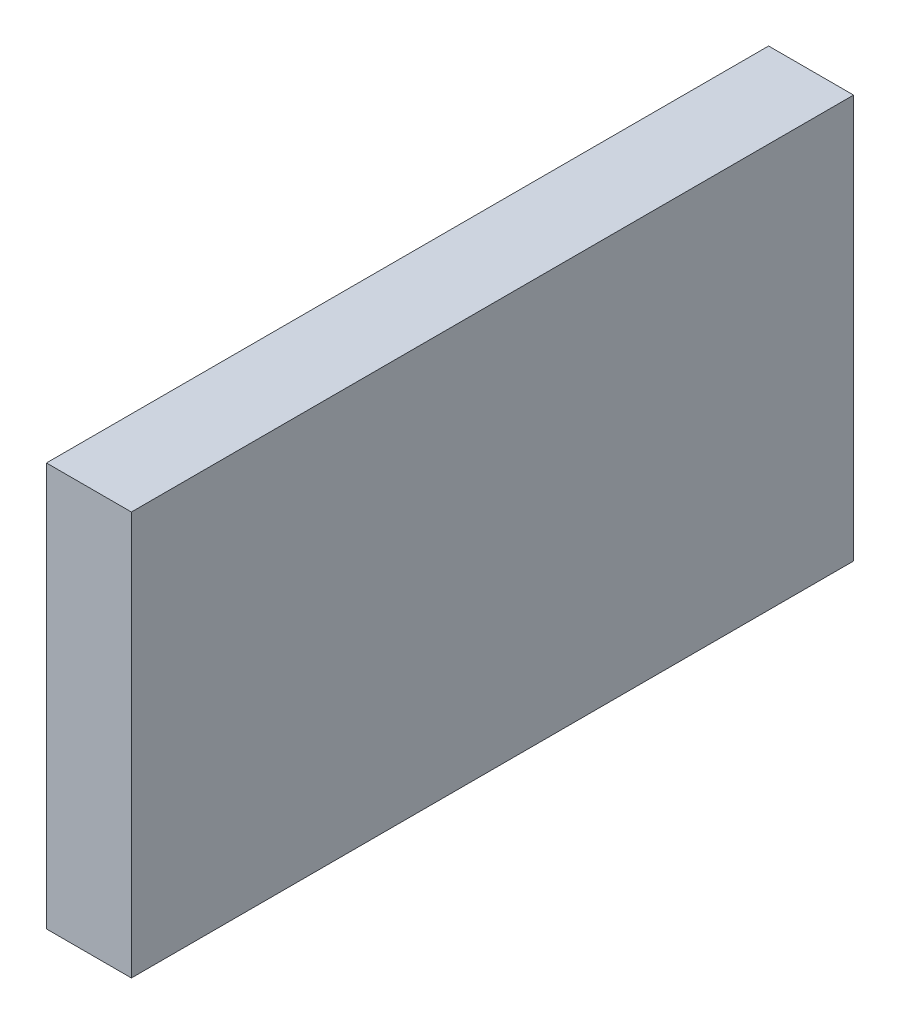
ISO-10303-21;
HEADER;
FILE_DESCRIPTION(('STEP AP214'),'2;1');
FILE_NAME('part.step','',(''),(''),'','','');
FILE_SCHEMA(('AUTOMOTIVE_DESIGN { 1 0 10303 214 1 1 1 1 }'));
ENDSEC;
DATA;
#1=APPLICATION_CONTEXT('core data for automotive mechanical design processes');
#2=APPLICATION_PROTOCOL_DEFINITION('international standard','automotive_design',2000,#1);
#3=PRODUCT_CONTEXT('',#1,'mechanical');
#4=PRODUCT('Part','Part','',(#3));
#5=PRODUCT_RELATED_PRODUCT_CATEGORY('part','',(#4));
#6=PRODUCT_DEFINITION_FORMATION('','',#4);
#7=PRODUCT_DEFINITION_CONTEXT('part definition',#1,'design');
#8=PRODUCT_DEFINITION('design','',#6,#7);
#9=PRODUCT_DEFINITION_SHAPE('','',#8);
#10=(LENGTH_UNIT() NAMED_UNIT(*) SI_UNIT(.MILLI.,.METRE.));
#11=(NAMED_UNIT(*) PLANE_ANGLE_UNIT() SI_UNIT($,.RADIAN.));
#12=(NAMED_UNIT(*) SI_UNIT($,.STERADIAN.) SOLID_ANGLE_UNIT());
#13=UNCERTAINTY_MEASURE_WITH_UNIT(LENGTH_MEASURE(1.E-05),#10,'distance_accuracy_value','');
#14=(GEOMETRIC_REPRESENTATION_CONTEXT(3) GLOBAL_UNCERTAINTY_ASSIGNED_CONTEXT((#13)) GLOBAL_UNIT_ASSIGNED_CONTEXT((#10,
#11,#12)) REPRESENTATION_CONTEXT('',''));
#15=CARTESIAN_POINT('',(0.,0.,0.));
#16=DIRECTION('',(0.,0.,1.));
#17=DIRECTION('',(1.,0.,0.));
#18=AXIS2_PLACEMENT_3D('',#15,#16,#17);
#19=CARTESIAN_POINT('',(0.,0.,863.6));
#20=DIRECTION('',(1.,0.,0.));
#21=DIRECTION('',(0.,0.,-1.));
#22=AXIS2_PLACEMENT_3D('',#19,#20,#21);
#23=PLANE('',#22);
#24=DIRECTION('',(0.,-1.,0.));
#25=VECTOR('',#24,1.);
#26=CARTESIAN_POINT('',(0.,0.,0.));
#27=LINE('',#26,#25);
#28=CARTESIAN_POINT('',(0.,482.6,0.));
#29=VERTEX_POINT('',#28);
#30=CARTESIAN_POINT('',(0.,0.,0.));
#31=VERTEX_POINT('',#30);
#32=EDGE_CURVE('E96',#29,#31,#27,.T.);
#33=ORIENTED_EDGE('',*,*,#32,.T.);
#34=DIRECTION('',(0.,0.,-1.));
#35=VECTOR('',#34,1.);
#36=CARTESIAN_POINT('',(0.,0.,863.6));
#37=LINE('',#36,#35);
#38=CARTESIAN_POINT('',(0.,0.,863.6));
#39=VERTEX_POINT('',#38);
#40=EDGE_CURVE('E11',#39,#31,#37,.T.);
#41=ORIENTED_EDGE('',*,*,#40,.F.);
#42=DIRECTION('',(0.,-1.,0.));
#43=VECTOR('',#42,1.);
#44=CARTESIAN_POINT('',(0.,0.,863.6));
#45=LINE('',#44,#43);
#46=CARTESIAN_POINT('',(0.,482.6,863.6));
#47=VERTEX_POINT('',#46);
#48=EDGE_CURVE('E84',#47,#39,#45,.T.);
#49=ORIENTED_EDGE('',*,*,#48,.F.);
#50=DIRECTION('',(0.,0.,-1.));
#51=VECTOR('',#50,1.);
#52=CARTESIAN_POINT('',(0.,482.6,863.6));
#53=LINE('',#52,#51);
#54=EDGE_CURVE('E92',#47,#29,#53,.T.);
#55=ORIENTED_EDGE('',*,*,#54,.T.);
#56=EDGE_LOOP('',(#33,#41,#49,#55));
#57=FACE_BOUND('',#56,.T.);
#58=ADVANCED_FACE('F33',(#57),#23,.F.);
#59=CARTESIAN_POINT('',(0.,0.,863.6));
#60=DIRECTION('',(0.,1.,0.));
#61=DIRECTION('',(0.,0.,1.));
#62=AXIS2_PLACEMENT_3D('',#59,#60,#61);
#63=PLANE('',#62);
#64=DIRECTION('',(1.,0.,0.));
#65=VECTOR('',#64,1.);
#66=CARTESIAN_POINT('',(0.,0.,0.));
#67=LINE('',#66,#65);
#68=CARTESIAN_POINT('',(101.6,0.,0.));
#69=VERTEX_POINT('',#68);
#70=EDGE_CURVE('E88',#31,#69,#67,.T.);
#71=ORIENTED_EDGE('',*,*,#70,.T.);
#72=DIRECTION('',(0.,0.,-1.));
#73=VECTOR('',#72,1.);
#74=CARTESIAN_POINT('',(101.6,0.,863.6));
#75=LINE('',#74,#73);
#76=CARTESIAN_POINT('',(101.6,0.,863.6));
#77=VERTEX_POINT('',#76);
#78=EDGE_CURVE('E41',#77,#69,#75,.T.);
#79=ORIENTED_EDGE('',*,*,#78,.F.);
#80=DIRECTION('',(1.,0.,0.));
#81=VECTOR('',#80,1.);
#82=CARTESIAN_POINT('',(0.,0.,863.6));
#83=LINE('',#82,#81);
#84=EDGE_CURVE('E79',#39,#77,#83,.T.);
#85=ORIENTED_EDGE('',*,*,#84,.F.);
#86=ORIENTED_EDGE('',*,*,#40,.T.);
#87=EDGE_LOOP('',(#71,#79,#85,#86));
#88=FACE_BOUND('',#87,.T.);
#89=ADVANCED_FACE('F87',(#88),#63,.F.);
#90=CARTESIAN_POINT('',(101.6,0.,863.6));
#91=DIRECTION('',(-1.,0.,0.));
#92=DIRECTION('',(0.,0.,1.));
#93=AXIS2_PLACEMENT_3D('',#90,#91,#92);
#94=PLANE('',#93);
#95=DIRECTION('',(0.,1.,0.));
#96=VECTOR('',#95,1.);
#97=CARTESIAN_POINT('',(101.6,0.,0.));
#98=LINE('',#97,#96);
#99=CARTESIAN_POINT('',(101.6,482.6,0.));
#100=VERTEX_POINT('',#99);
#101=EDGE_CURVE('E66',#69,#100,#98,.T.);
#102=ORIENTED_EDGE('',*,*,#101,.T.);
#103=DIRECTION('',(0.,0.,-1.));
#104=VECTOR('',#103,1.);
#105=CARTESIAN_POINT('',(101.6,482.6,863.6));
#106=LINE('',#105,#104);
#107=CARTESIAN_POINT('',(101.6,482.6,863.6));
#108=VERTEX_POINT('',#107);
#109=EDGE_CURVE('E89',#108,#100,#106,.T.);
#110=ORIENTED_EDGE('',*,*,#109,.F.);
#111=DIRECTION('',(0.,1.,0.));
#112=VECTOR('',#111,1.);
#113=CARTESIAN_POINT('',(101.6,0.,863.6));
#114=LINE('',#113,#112);
#115=EDGE_CURVE('E82',#77,#108,#114,.T.);
#116=ORIENTED_EDGE('',*,*,#115,.F.);
#117=ORIENTED_EDGE('',*,*,#78,.T.);
#118=EDGE_LOOP('',(#102,#110,#116,#117));
#119=FACE_BOUND('',#118,.T.);
#120=ADVANCED_FACE('F90',(#119),#94,.F.);
#121=CARTESIAN_POINT('',(0.,482.6,863.6));
#122=DIRECTION('',(0.,-1.,0.));
#123=DIRECTION('',(0.,0.,-1.));
#124=AXIS2_PLACEMENT_3D('',#121,#122,#123);
#125=PLANE('',#124);
#126=DIRECTION('',(-1.,0.,0.));
#127=VECTOR('',#126,1.);
#128=CARTESIAN_POINT('',(0.,482.6,0.));
#129=LINE('',#128,#127);
#130=EDGE_CURVE('E72',#100,#29,#129,.T.);
#131=ORIENTED_EDGE('',*,*,#130,.T.);
#132=ORIENTED_EDGE('',*,*,#54,.F.);
#133=DIRECTION('',(-1.,0.,0.));
#134=VECTOR('',#133,1.);
#135=CARTESIAN_POINT('',(0.,482.6,863.6));
#136=LINE('',#135,#134);
#137=EDGE_CURVE('E49',#108,#47,#136,.T.);
#138=ORIENTED_EDGE('',*,*,#137,.F.);
#139=ORIENTED_EDGE('',*,*,#109,.T.);
#140=EDGE_LOOP('',(#131,#132,#138,#139));
#141=FACE_BOUND('',#140,.T.);
#142=ADVANCED_FACE('F103',(#141),#125,.F.);
#143=CARTESIAN_POINT('',(0.,0.,863.6));
#144=DIRECTION('',(0.,0.,-1.));
#145=DIRECTION('',(-1.,0.,0.));
#146=AXIS2_PLACEMENT_3D('',#143,#144,#145);
#147=PLANE('',#146);
#148=ORIENTED_EDGE('',*,*,#48,.T.);
#149=ORIENTED_EDGE('',*,*,#84,.T.);
#150=ORIENTED_EDGE('',*,*,#115,.T.);
#151=ORIENTED_EDGE('',*,*,#137,.T.);
#152=EDGE_LOOP('',(#148,#149,#150,#151));
#153=FACE_BOUND('',#152,.T.);
#154=ADVANCED_FACE('F80',(#153),#147,.F.);
#155=CARTESIAN_POINT('',(0.,0.,0.));
#156=DIRECTION('',(0.,0.,-1.));
#157=DIRECTION('',(-1.,0.,0.));
#158=AXIS2_PLACEMENT_3D('',#155,#156,#157);
#159=PLANE('',#158);
#160=ORIENTED_EDGE('',*,*,#32,.F.);
#161=ORIENTED_EDGE('',*,*,#130,.F.);
#162=ORIENTED_EDGE('',*,*,#101,.F.);
#163=ORIENTED_EDGE('',*,*,#70,.F.);
#164=EDGE_LOOP('',(#160,#161,#162,#163));
#165=FACE_BOUND('',#164,.T.);
#166=ADVANCED_FACE('F106',(#165),#159,.T.);
#167=CLOSED_SHELL('',(#58,#89,#120,#142,#154,#166));
#168=MANIFOLD_SOLID_BREP('B2',#167);
#169=ADVANCED_BREP_SHAPE_REPRESENTATION('',(#18,#168),#14);
#170=SHAPE_DEFINITION_REPRESENTATION(#9,#169);
ENDSEC;
END-ISO-10303-21;
